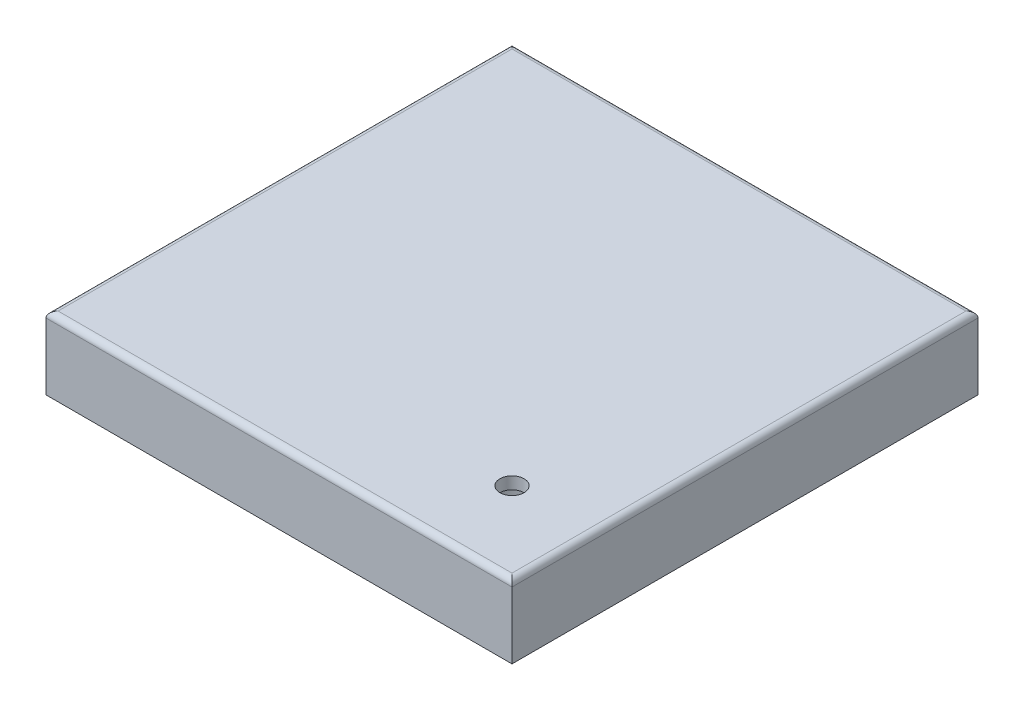
ISO-10303-21;
HEADER;
FILE_DESCRIPTION(('STEP AP214'),'2;1');
FILE_NAME('part.step','',(''),(''),'','','');
FILE_SCHEMA(('AUTOMOTIVE_DESIGN { 1 0 10303 214 1 1 1 1 }'));
ENDSEC;
DATA;
#1=APPLICATION_CONTEXT('core data for automotive mechanical design processes');
#2=APPLICATION_PROTOCOL_DEFINITION('international standard','automotive_design',2000,#1);
#3=PRODUCT_CONTEXT('',#1,'mechanical');
#4=PRODUCT('Part','Part','',(#3));
#5=PRODUCT_RELATED_PRODUCT_CATEGORY('part','',(#4));
#6=PRODUCT_DEFINITION_FORMATION('','',#4);
#7=PRODUCT_DEFINITION_CONTEXT('part definition',#1,'design');
#8=PRODUCT_DEFINITION('design','',#6,#7);
#9=PRODUCT_DEFINITION_SHAPE('','',#8);
#10=(LENGTH_UNIT() NAMED_UNIT(*) SI_UNIT(.MILLI.,.METRE.));
#11=(NAMED_UNIT(*) PLANE_ANGLE_UNIT() SI_UNIT($,.RADIAN.));
#12=(NAMED_UNIT(*) SI_UNIT($,.STERADIAN.) SOLID_ANGLE_UNIT());
#13=UNCERTAINTY_MEASURE_WITH_UNIT(LENGTH_MEASURE(1.E-05),#10,'distance_accuracy_value','');
#14=(GEOMETRIC_REPRESENTATION_CONTEXT(3) GLOBAL_UNCERTAINTY_ASSIGNED_CONTEXT((#13)) GLOBAL_UNIT_ASSIGNED_CONTEXT((#10,
#11,#12)) REPRESENTATION_CONTEXT('',''));
#15=CARTESIAN_POINT('',(0.,0.,0.));
#16=DIRECTION('',(0.,0.,1.));
#17=DIRECTION('',(1.,0.,0.));
#18=AXIS2_PLACEMENT_3D('',#15,#16,#17);
#19=CARTESIAN_POINT('',(23.9999999999999,-13.,-58.0543320314029));
#20=DIRECTION('',(0.,0.,1.));
#21=DIRECTION('',(1.,0.,0.));
#22=AXIS2_PLACEMENT_3D('',#19,#20,#21);
#23=PLANE('',#22);
#24=DIRECTION('',(0.,1.,0.));
#25=VECTOR('',#24,1.);
#26=CARTESIAN_POINT('',(23.9999999999999,-13.,-58.0543320314029));
#27=LINE('',#26,#25);
#28=CARTESIAN_POINT('',(23.9999999999999,-13.,-58.0543320314029));
#29=VERTEX_POINT('',#28);
#30=CARTESIAN_POINT('',(23.9999999999999,-10.,-58.0543320314029));
#31=VERTEX_POINT('',#30);
#32=EDGE_CURVE('E202',#29,#31,#27,.T.);
#33=ORIENTED_EDGE('',*,*,#32,.T.);
#34=DIRECTION('',(-1.,0.,0.));
#35=VECTOR('',#34,1.);
#36=CARTESIAN_POINT('',(-42.0000000000001,-10.,-58.0543320314029));
#37=LINE('',#36,#35);
#38=CARTESIAN_POINT('',(-17.0000000000001,-10.,-58.0543320314029));
#39=VERTEX_POINT('',#38);
#40=EDGE_CURVE('E78',#31,#39,#37,.T.);
#41=ORIENTED_EDGE('',*,*,#40,.T.);
#42=DIRECTION('',(0.,1.,0.));
#43=VECTOR('',#42,1.);
#44=CARTESIAN_POINT('',(-17.0000000000001,-13.,-58.0543320314029));
#45=LINE('',#44,#43);
#46=CARTESIAN_POINT('',(-17.0000000000001,-13.,-58.0543320314029));
#47=VERTEX_POINT('',#46);
#48=EDGE_CURVE('E167',#47,#39,#45,.T.);
#49=ORIENTED_EDGE('',*,*,#48,.F.);
#50=DIRECTION('',(1.,0.,0.));
#51=VECTOR('',#50,1.);
#52=CARTESIAN_POINT('',(23.9999999999999,-13.,-58.0543320314029));
#53=LINE('',#52,#51);
#54=EDGE_CURVE('E177',#47,#29,#53,.T.);
#55=ORIENTED_EDGE('',*,*,#54,.T.);
#56=EDGE_LOOP('',(#33,#41,#49,#55));
#57=FACE_BOUND('',#56,.T.);
#58=ADVANCED_FACE('F68',(#57),#23,.T.);
#59=CARTESIAN_POINT('',(0.,-13.,0.));
#60=DIRECTION('',(0.,-1.,0.));
#61=DIRECTION('',(0.,0.,-1.));
#62=AXIS2_PLACEMENT_3D('',#59,#60,#61);
#63=PLANE('',#62);
#64=DIRECTION('',(0.,0.,-1.));
#65=VECTOR('',#64,1.);
#66=CARTESIAN_POINT('',(-17.0000000000001,-13.,-53.5543320314029));
#67=LINE('',#66,#65);
#68=CARTESIAN_POINT('',(-17.0000000000001,-13.,-60.0543320314029));
#69=VERTEX_POINT('',#68);
#70=EDGE_CURVE('E163',#47,#69,#67,.T.);
#71=ORIENTED_EDGE('',*,*,#70,.T.);
#72=DIRECTION('',(1.,0.,0.));
#73=VECTOR('',#72,1.);
#74=CARTESIAN_POINT('',(25.9999999999999,-13.,-60.0543320314029));
#75=LINE('',#74,#73);
#76=CARTESIAN_POINT('',(25.9999999999999,-13.,-60.0543320314029));
#77=VERTEX_POINT('',#76);
#78=EDGE_CURVE('E210',#69,#77,#75,.T.);
#79=ORIENTED_EDGE('',*,*,#78,.T.);
#80=DIRECTION('',(0.,0.,1.));
#81=VECTOR('',#80,1.);
#82=CARTESIAN_POINT('',(25.9999999999999,-13.,-60.0543320314029));
#83=LINE('',#82,#81);
#84=CARTESIAN_POINT('',(25.9999999999999,-13.,9.94566796859713));
#85=VERTEX_POINT('',#84);
#86=EDGE_CURVE('E215',#77,#85,#83,.T.);
#87=ORIENTED_EDGE('',*,*,#86,.T.);
#88=DIRECTION('',(-1.,0.,0.));
#89=VECTOR('',#88,1.);
#90=CARTESIAN_POINT('',(25.9999999999999,-13.,9.94566796859713));
#91=LINE('',#90,#89);
#92=CARTESIAN_POINT('',(-44.0000000000001,-13.,9.94566796859712));
#93=VERTEX_POINT('',#92);
#94=EDGE_CURVE('E217',#85,#93,#91,.T.);
#95=ORIENTED_EDGE('',*,*,#94,.T.);
#96=DIRECTION('',(0.,0.,-1.));
#97=VECTOR('',#96,1.);
#98=CARTESIAN_POINT('',(-44.0000000000001,-13.,-60.0543320314029));
#99=LINE('',#98,#97);
#100=CARTESIAN_POINT('',(-44.0000000000001,-13.,-60.0543320314029));
#101=VERTEX_POINT('',#100);
#102=EDGE_CURVE('E207',#93,#101,#99,.T.);
#103=ORIENTED_EDGE('',*,*,#102,.T.);
#104=CARTESIAN_POINT('',(-32.0000000000001,-13.,-60.0543320314029));
#105=VERTEX_POINT('',#104);
#106=EDGE_CURVE('E212',#101,#105,#75,.T.);
#107=ORIENTED_EDGE('',*,*,#106,.T.);
#108=DIRECTION('',(0.,0.,-1.));
#109=VECTOR('',#108,1.);
#110=CARTESIAN_POINT('',(-32.0000000000001,-13.,-53.5543320314029));
#111=LINE('',#110,#109);
#112=CARTESIAN_POINT('',(-32.0000000000001,-13.,-58.0543320314029));
#113=VERTEX_POINT('',#112);
#114=EDGE_CURVE('E174',#113,#105,#111,.T.);
#115=ORIENTED_EDGE('',*,*,#114,.F.);
#116=CARTESIAN_POINT('',(-42.0000000000001,-13.,-58.0543320314029));
#117=VERTEX_POINT('',#116);
#118=EDGE_CURVE('E187',#117,#113,#53,.T.);
#119=ORIENTED_EDGE('',*,*,#118,.F.);
#120=DIRECTION('',(0.,0.,-1.));
#121=VECTOR('',#120,1.);
#122=CARTESIAN_POINT('',(-42.0000000000001,-13.,-58.0543320314029));
#123=LINE('',#122,#121);
#124=CARTESIAN_POINT('',(-42.0000000000001,-13.,7.94566796859712));
#125=VERTEX_POINT('',#124);
#126=EDGE_CURVE('E188',#125,#117,#123,.T.);
#127=ORIENTED_EDGE('',*,*,#126,.F.);
#128=DIRECTION('',(-1.,0.,0.));
#129=VECTOR('',#128,1.);
#130=CARTESIAN_POINT('',(23.9999999999999,-13.,7.94566796859712));
#131=LINE('',#130,#129);
#132=CARTESIAN_POINT('',(23.9999999999999,-13.,7.94566796859712));
#133=VERTEX_POINT('',#132);
#134=EDGE_CURVE('E195',#133,#125,#131,.T.);
#135=ORIENTED_EDGE('',*,*,#134,.F.);
#136=DIRECTION('',(0.,0.,1.));
#137=VECTOR('',#136,1.);
#138=CARTESIAN_POINT('',(23.9999999999999,-13.,-58.0543320314029));
#139=LINE('',#138,#137);
#140=EDGE_CURVE('E186',#29,#133,#139,.T.);
#141=ORIENTED_EDGE('',*,*,#140,.F.);
#142=ORIENTED_EDGE('',*,*,#54,.F.);
#143=EDGE_LOOP('',(#71,#79,#87,#95,#103,#107,#115,#119,#127,#135,#141,#142));
#144=FACE_BOUND('',#143,.T.);
#145=ADVANCED_FACE('F183',(#144),#63,.T.);
#146=CARTESIAN_POINT('',(-44.0000000000001,-13.,-60.0543320314029));
#147=DIRECTION('',(1.,0.,0.));
#148=DIRECTION('',(0.,0.,-1.));
#149=AXIS2_PLACEMENT_3D('',#146,#147,#148);
#150=PLANE('',#149);
#151=DIRECTION('',(0.,0.,-1.));
#152=VECTOR('',#151,1.);
#153=CARTESIAN_POINT('',(-44.0000000000001,-8.,-60.0543320314029));
#154=LINE('',#153,#152);
#155=CARTESIAN_POINT('',(-44.0000000000001,-8.,9.94566796859712));
#156=VERTEX_POINT('',#155);
#157=CARTESIAN_POINT('',(-44.0000000000001,-8.,-60.0543320314029));
#158=VERTEX_POINT('',#157);
#159=EDGE_CURVE('E206',#156,#158,#154,.T.);
#160=ORIENTED_EDGE('',*,*,#159,.T.);
#161=DIRECTION('',(0.,1.,0.));
#162=VECTOR('',#161,1.);
#163=CARTESIAN_POINT('',(-44.0000000000001,-13.,-60.0543320314029));
#164=LINE('',#163,#162);
#165=EDGE_CURVE('E236',#101,#158,#164,.T.);
#166=ORIENTED_EDGE('',*,*,#165,.F.);
#167=ORIENTED_EDGE('',*,*,#102,.F.);
#168=DIRECTION('',(0.,1.,0.));
#169=VECTOR('',#168,1.);
#170=CARTESIAN_POINT('',(-44.0000000000001,-13.,9.94566796859712));
#171=LINE('',#170,#169);
#172=EDGE_CURVE('E219',#93,#156,#171,.T.);
#173=ORIENTED_EDGE('',*,*,#172,.T.);
#174=EDGE_LOOP('',(#160,#166,#167,#173));
#175=FACE_BOUND('',#174,.T.);
#176=ADVANCED_FACE('F300',(#175),#150,.F.);
#177=CARTESIAN_POINT('',(25.9999999999999,-13.,-60.0543320314029));
#178=DIRECTION('',(0.,0.,1.));
#179=DIRECTION('',(1.,0.,0.));
#180=AXIS2_PLACEMENT_3D('',#177,#178,#179);
#181=PLANE('',#180);
#182=ORIENTED_EDGE('',*,*,#78,.F.);
#183=DIRECTION('',(0.,1.,0.));
#184=VECTOR('',#183,1.);
#185=CARTESIAN_POINT('',(-17.0000000000001,-13.,-60.0543320314029));
#186=LINE('',#185,#184);
#187=CARTESIAN_POINT('',(-17.0000000000001,-10.,-60.0543320314029));
#188=VERTEX_POINT('',#187);
#189=EDGE_CURVE('E170',#69,#188,#186,.T.);
#190=ORIENTED_EDGE('',*,*,#189,.T.);
#191=DIRECTION('',(-1.,0.,0.));
#192=VECTOR('',#191,1.);
#193=CARTESIAN_POINT('',(25.9999999999999,-10.,-60.0543320314029));
#194=LINE('',#193,#192);
#195=CARTESIAN_POINT('',(-32.0000000000001,-10.,-60.0543320314029));
#196=VERTEX_POINT('',#195);
#197=EDGE_CURVE('E284',#188,#196,#194,.T.);
#198=ORIENTED_EDGE('',*,*,#197,.T.);
#199=DIRECTION('',(0.,-1.,0.));
#200=VECTOR('',#199,1.);
#201=CARTESIAN_POINT('',(-32.0000000000001,-13.,-60.0543320314029));
#202=LINE('',#201,#200);
#203=EDGE_CURVE('E282',#196,#105,#202,.T.);
#204=ORIENTED_EDGE('',*,*,#203,.T.);
#205=ORIENTED_EDGE('',*,*,#106,.F.);
#206=ORIENTED_EDGE('',*,*,#165,.T.);
#207=DIRECTION('',(1.,0.,0.));
#208=VECTOR('',#207,1.);
#209=CARTESIAN_POINT('',(25.9999999999999,-8.,-60.0543320314029));
#210=LINE('',#209,#208);
#211=CARTESIAN_POINT('',(25.9999999999999,-8.,-60.0543320314029));
#212=VERTEX_POINT('',#211);
#213=EDGE_CURVE('E222',#158,#212,#210,.T.);
#214=ORIENTED_EDGE('',*,*,#213,.T.);
#215=DIRECTION('',(0.,1.,0.));
#216=VECTOR('',#215,1.);
#217=CARTESIAN_POINT('',(25.9999999999999,-13.,-60.0543320314029));
#218=LINE('',#217,#216);
#219=EDGE_CURVE('E233',#77,#212,#218,.T.);
#220=ORIENTED_EDGE('',*,*,#219,.F.);
#221=EDGE_LOOP('',(#182,#190,#198,#204,#205,#206,#214,#220));
#222=FACE_BOUND('',#221,.T.);
#223=ADVANCED_FACE('F286',(#222),#181,.F.);
#224=CARTESIAN_POINT('',(25.9999999999999,-13.,-60.0543320314029));
#225=DIRECTION('',(-1.,0.,0.));
#226=DIRECTION('',(0.,0.,1.));
#227=AXIS2_PLACEMENT_3D('',#224,#225,#226);
#228=PLANE('',#227);
#229=DIRECTION('',(0.,0.,1.));
#230=VECTOR('',#229,1.);
#231=CARTESIAN_POINT('',(25.9999999999999,-8.,-60.0543320314029));
#232=LINE('',#231,#230);
#233=CARTESIAN_POINT('',(25.9999999999999,-8.,9.94566796859713));
#234=VERTEX_POINT('',#233);
#235=EDGE_CURVE('E224',#212,#234,#232,.T.);
#236=ORIENTED_EDGE('',*,*,#235,.T.);
#237=DIRECTION('',(0.,1.,0.));
#238=VECTOR('',#237,1.);
#239=CARTESIAN_POINT('',(25.9999999999999,-13.,9.94566796859713));
#240=LINE('',#239,#238);
#241=EDGE_CURVE('E230',#85,#234,#240,.T.);
#242=ORIENTED_EDGE('',*,*,#241,.F.);
#243=ORIENTED_EDGE('',*,*,#86,.F.);
#244=ORIENTED_EDGE('',*,*,#219,.T.);
#245=EDGE_LOOP('',(#236,#242,#243,#244));
#246=FACE_BOUND('',#245,.T.);
#247=ADVANCED_FACE('F293',(#246),#228,.F.);
#248=CARTESIAN_POINT('',(25.9999999999999,-13.,9.94566796859713));
#249=DIRECTION('',(0.,0.,-1.));
#250=DIRECTION('',(-1.,0.,0.));
#251=AXIS2_PLACEMENT_3D('',#248,#249,#250);
#252=PLANE('',#251);
#253=DIRECTION('',(-1.,0.,0.));
#254=VECTOR('',#253,1.);
#255=CARTESIAN_POINT('',(25.9999999999999,-8.,9.94566796859713));
#256=LINE('',#255,#254);
#257=EDGE_CURVE('E211',#234,#156,#256,.T.);
#258=ORIENTED_EDGE('',*,*,#257,.T.);
#259=ORIENTED_EDGE('',*,*,#172,.F.);
#260=ORIENTED_EDGE('',*,*,#94,.F.);
#261=ORIENTED_EDGE('',*,*,#241,.T.);
#262=EDGE_LOOP('',(#258,#259,#260,#261));
#263=FACE_BOUND('',#262,.T.);
#264=ADVANCED_FACE('F295',(#263),#252,.F.);
#265=CARTESIAN_POINT('',(-42.0000000000001,-13.,-58.0543320314029));
#266=DIRECTION('',(1.,0.,0.));
#267=DIRECTION('',(0.,0.,-1.));
#268=AXIS2_PLACEMENT_3D('',#265,#266,#267);
#269=PLANE('',#268);
#270=DIRECTION('',(0.,1.,0.));
#271=VECTOR('',#270,1.);
#272=CARTESIAN_POINT('',(-42.0000000000001,-13.,-58.0543320314029));
#273=LINE('',#272,#271);
#274=CARTESIAN_POINT('',(-42.0000000000001,-10.,-58.0543320314029));
#275=VERTEX_POINT('',#274);
#276=EDGE_CURVE('E204',#117,#275,#273,.T.);
#277=ORIENTED_EDGE('',*,*,#276,.T.);
#278=DIRECTION('',(0.,0.,1.));
#279=VECTOR('',#278,1.);
#280=CARTESIAN_POINT('',(-42.0000000000001,-10.,7.94566796859712));
#281=LINE('',#280,#279);
#282=CARTESIAN_POINT('',(-42.0000000000001,-10.,7.94566796859712));
#283=VERTEX_POINT('',#282);
#284=EDGE_CURVE('E13',#275,#283,#281,.T.);
#285=ORIENTED_EDGE('',*,*,#284,.T.);
#286=DIRECTION('',(0.,1.,0.));
#287=VECTOR('',#286,1.);
#288=CARTESIAN_POINT('',(-42.0000000000001,-13.,7.94566796859712));
#289=LINE('',#288,#287);
#290=EDGE_CURVE('E197',#125,#283,#289,.T.);
#291=ORIENTED_EDGE('',*,*,#290,.F.);
#292=ORIENTED_EDGE('',*,*,#126,.T.);
#293=EDGE_LOOP('',(#277,#285,#291,#292));
#294=FACE_BOUND('',#293,.T.);
#295=ADVANCED_FACE('F311',(#294),#269,.T.);
#296=DIRECTION('',(0.,-1.,0.));
#297=VECTOR('',#296,1.);
#298=CARTESIAN_POINT('',(-32.0000000000001,-13.,-58.0543320314029));
#299=LINE('',#298,#297);
#300=CARTESIAN_POINT('',(-32.0000000000001,-10.,-58.0543320314029));
#301=VERTEX_POINT('',#300);
#302=EDGE_CURVE('E238',#301,#113,#299,.T.);
#303=ORIENTED_EDGE('',*,*,#302,.F.);
#304=DIRECTION('',(-1.,0.,0.));
#305=VECTOR('',#304,1.);
#306=CARTESIAN_POINT('',(-42.0000000000001,-10.,-58.0543320314029));
#307=LINE('',#306,#305);
#308=EDGE_CURVE('E86',#301,#275,#307,.T.);
#309=ORIENTED_EDGE('',*,*,#308,.T.);
#310=ORIENTED_EDGE('',*,*,#276,.F.);
#311=ORIENTED_EDGE('',*,*,#118,.T.);
#312=EDGE_LOOP('',(#303,#309,#310,#311));
#313=FACE_BOUND('',#312,.T.);
#314=ADVANCED_FACE('F271',(#313),#23,.T.);
#315=CARTESIAN_POINT('',(23.9999999999999,-13.,-58.0543320314029));
#316=DIRECTION('',(-1.,0.,0.));
#317=DIRECTION('',(0.,0.,1.));
#318=AXIS2_PLACEMENT_3D('',#315,#316,#317);
#319=PLANE('',#318);
#320=DIRECTION('',(0.,1.,0.));
#321=VECTOR('',#320,1.);
#322=CARTESIAN_POINT('',(23.9999999999999,-13.,7.94566796859712));
#323=LINE('',#322,#321);
#324=CARTESIAN_POINT('',(23.9999999999999,-10.,7.94566796859712));
#325=VERTEX_POINT('',#324);
#326=EDGE_CURVE('E200',#133,#325,#323,.T.);
#327=ORIENTED_EDGE('',*,*,#326,.T.);
#328=DIRECTION('',(0.,0.,-1.));
#329=VECTOR('',#328,1.);
#330=CARTESIAN_POINT('',(23.9999999999999,-10.,-58.0543320314029));
#331=LINE('',#330,#329);
#332=EDGE_CURVE('E94',#325,#31,#331,.T.);
#333=ORIENTED_EDGE('',*,*,#332,.T.);
#334=ORIENTED_EDGE('',*,*,#32,.F.);
#335=ORIENTED_EDGE('',*,*,#140,.T.);
#336=EDGE_LOOP('',(#327,#333,#334,#335));
#337=FACE_BOUND('',#336,.T.);
#338=ADVANCED_FACE('F309',(#337),#319,.T.);
#339=CARTESIAN_POINT('',(23.9999999999999,-13.,7.94566796859712));
#340=DIRECTION('',(0.,0.,-1.));
#341=DIRECTION('',(-1.,0.,0.));
#342=AXIS2_PLACEMENT_3D('',#339,#340,#341);
#343=PLANE('',#342);
#344=ORIENTED_EDGE('',*,*,#290,.T.);
#345=DIRECTION('',(1.,0.,0.));
#346=VECTOR('',#345,1.);
#347=CARTESIAN_POINT('',(23.9999999999999,-10.,7.94566796859712));
#348=LINE('',#347,#346);
#349=EDGE_CURVE('E179',#283,#325,#348,.T.);
#350=ORIENTED_EDGE('',*,*,#349,.T.);
#351=ORIENTED_EDGE('',*,*,#326,.F.);
#352=ORIENTED_EDGE('',*,*,#134,.T.);
#353=EDGE_LOOP('',(#344,#350,#351,#352));
#354=FACE_BOUND('',#353,.T.);
#355=ADVANCED_FACE('F307',(#354),#343,.T.);
#356=CARTESIAN_POINT('',(-17.0000000000001,-13.,-53.5543320314029));
#357=DIRECTION('',(1.,0.,0.));
#358=DIRECTION('',(0.,0.,-1.));
#359=AXIS2_PLACEMENT_3D('',#356,#357,#358);
#360=PLANE('',#359);
#361=ORIENTED_EDGE('',*,*,#70,.F.);
#362=ORIENTED_EDGE('',*,*,#48,.T.);
#363=DIRECTION('',(0.,0.,-1.));
#364=VECTOR('',#363,1.);
#365=CARTESIAN_POINT('',(-17.0000000000001,-10.,-53.5543320314029));
#366=LINE('',#365,#364);
#367=EDGE_CURVE('E270',#39,#188,#366,.T.);
#368=ORIENTED_EDGE('',*,*,#367,.T.);
#369=ORIENTED_EDGE('',*,*,#189,.F.);
#370=EDGE_LOOP('',(#361,#362,#368,#369));
#371=FACE_BOUND('',#370,.T.);
#372=ADVANCED_FACE('F165',(#371),#360,.F.);
#373=CARTESIAN_POINT('',(-17.0000000000001,-10.,-53.5543320314029));
#374=DIRECTION('',(0.,1.,0.));
#375=DIRECTION('',(0.,0.,1.));
#376=AXIS2_PLACEMENT_3D('',#373,#374,#375);
#377=PLANE('',#376);
#378=ORIENTED_EDGE('',*,*,#367,.F.);
#379=DIRECTION('',(-1.,0.,0.));
#380=VECTOR('',#379,1.);
#381=CARTESIAN_POINT('',(23.9999999999999,-10.,-58.0543320314029));
#382=LINE('',#381,#380);
#383=EDGE_CURVE('E180',#39,#301,#382,.T.);
#384=ORIENTED_EDGE('',*,*,#383,.T.);
#385=DIRECTION('',(0.,0.,-1.));
#386=VECTOR('',#385,1.);
#387=CARTESIAN_POINT('',(-32.0000000000001,-10.,-53.5543320314029));
#388=LINE('',#387,#386);
#389=EDGE_CURVE('E268',#301,#196,#388,.T.);
#390=ORIENTED_EDGE('',*,*,#389,.T.);
#391=ORIENTED_EDGE('',*,*,#197,.F.);
#392=EDGE_LOOP('',(#378,#384,#390,#391));
#393=FACE_BOUND('',#392,.T.);
#394=ADVANCED_FACE('F267',(#393),#377,.F.);
#395=CARTESIAN_POINT('',(-32.0000000000001,-13.,-53.5543320314029));
#396=DIRECTION('',(-1.,0.,0.));
#397=DIRECTION('',(0.,0.,1.));
#398=AXIS2_PLACEMENT_3D('',#395,#396,#397);
#399=PLANE('',#398);
#400=ORIENTED_EDGE('',*,*,#389,.F.);
#401=ORIENTED_EDGE('',*,*,#302,.T.);
#402=ORIENTED_EDGE('',*,*,#114,.T.);
#403=ORIENTED_EDGE('',*,*,#203,.F.);
#404=EDGE_LOOP('',(#400,#401,#402,#403));
#405=FACE_BOUND('',#404,.T.);
#406=ADVANCED_FACE('F275',(#405),#399,.F.);
#407=CARTESIAN_POINT('',(0.,-8.,-60.0543320314029));
#408=DIRECTION('',(0.,0.707106781186545,0.70710678118655));
#409=DIRECTION('',(-1.,0.,0.));
#410=AXIS2_PLACEMENT_3D('',#407,#408,#409);
#411=PLANE('',#410);
#412=ORIENTED_EDGE('',*,*,#383,.F.);
#413=ORIENTED_EDGE('',*,*,#40,.F.);
#414=DIRECTION('',(0.577350269189624,0.577350269189628,-0.577350269189624));
#415=VECTOR('',#414,1.);
#416=CARTESIAN_POINT('',(5.98188932286574,-28.0181106771343,-40.0362213542687));
#417=LINE('',#416,#415);
#418=EDGE_CURVE('E73',#212,#31,#417,.F.);
#419=ORIENTED_EDGE('',*,*,#418,.F.);
#420=ORIENTED_EDGE('',*,*,#213,.F.);
#421=DIRECTION('',(-0.577350269189624,0.577350269189628,-0.577350269189624));
#422=VECTOR('',#421,1.);
#423=CARTESIAN_POINT('',(-29.3333333333334,-22.6666666666667,-45.3876653647363));
#424=LINE('',#423,#422);
#425=EDGE_CURVE('E250',#275,#158,#424,.T.);
#426=ORIENTED_EDGE('',*,*,#425,.F.);
#427=ORIENTED_EDGE('',*,*,#308,.F.);
#428=EDGE_LOOP('',(#412,#413,#419,#420,#426,#427));
#429=FACE_BOUND('',#428,.T.);
#430=ADVANCED_FACE('F71',(#429),#411,.T.);
#431=CARTESIAN_POINT('',(26.,-8.,0.));
#432=DIRECTION('',(-0.70710678118655,0.707106781186545,0.));
#433=DIRECTION('',(0.,0.,-1.));
#434=AXIS2_PLACEMENT_3D('',#431,#432,#433);
#435=PLANE('',#434);
#436=ORIENTED_EDGE('',*,*,#418,.T.);
#437=ORIENTED_EDGE('',*,*,#332,.F.);
#438=DIRECTION('',(0.577350269189624,0.577350269189628,0.577350269189624));
#439=VECTOR('',#438,1.);
#440=CARTESIAN_POINT('',(17.3333333333333,-16.6666666666667,1.27900130193051));
#441=LINE('',#440,#439);
#442=EDGE_CURVE('E249',#234,#325,#441,.F.);
#443=ORIENTED_EDGE('',*,*,#442,.F.);
#444=ORIENTED_EDGE('',*,*,#235,.F.);
#445=EDGE_LOOP('',(#436,#437,#443,#444));
#446=FACE_BOUND('',#445,.T.);
#447=ADVANCED_FACE('F260',(#446),#435,.T.);
#448=CARTESIAN_POINT('',(-44.0000000000001,-8.,0.));
#449=DIRECTION('',(0.70710678118655,0.707106781186545,0.));
#450=DIRECTION('',(0.,0.,1.));
#451=AXIS2_PLACEMENT_3D('',#448,#449,#450);
#452=PLANE('',#451);
#453=ORIENTED_EDGE('',*,*,#425,.T.);
#454=ORIENTED_EDGE('',*,*,#159,.F.);
#455=DIRECTION('',(0.577350269189624,-0.577350269189628,-0.577350269189624));
#456=VECTOR('',#455,1.);
#457=CARTESIAN_POINT('',(-29.3333333333334,-22.6666666666667,-4.7209986980695));
#458=LINE('',#457,#456);
#459=EDGE_CURVE('E247',#283,#156,#458,.F.);
#460=ORIENTED_EDGE('',*,*,#459,.F.);
#461=ORIENTED_EDGE('',*,*,#284,.F.);
#462=EDGE_LOOP('',(#453,#454,#460,#461));
#463=FACE_BOUND('',#462,.T.);
#464=ADVANCED_FACE('F302',(#463),#452,.T.);
#465=CARTESIAN_POINT('',(0.,-8.,9.94566796859712));
#466=DIRECTION('',(0.,0.707106781186545,-0.70710678118655));
#467=DIRECTION('',(1.,0.,0.));
#468=AXIS2_PLACEMENT_3D('',#465,#466,#467);
#469=PLANE('',#468);
#470=ORIENTED_EDGE('',*,*,#442,.T.);
#471=ORIENTED_EDGE('',*,*,#349,.F.);
#472=ORIENTED_EDGE('',*,*,#459,.T.);
#473=ORIENTED_EDGE('',*,*,#257,.F.);
#474=EDGE_LOOP('',(#470,#471,#472,#473));
#475=FACE_BOUND('',#474,.T.);
#476=ADVANCED_FACE('F305',(#475),#469,.T.);
#477=CLOSED_SHELL('',(#58,#145,#176,#223,#247,#264,#295,#314,#338,#355,#372,#394,#406,#430,#447,
#464,#476));
#478=MANIFOLD_SOLID_BREP('B2',#477);
#479=CARTESIAN_POINT('',(29.4999999999999,2.,-63.5543320314029));
#480=DIRECTION('',(-1.,0.,0.));
#481=DIRECTION('',(0.,0.,1.));
#482=AXIS2_PLACEMENT_3D('',#479,#480,#481);
#483=PLANE('',#482);
#484=DIRECTION('',(0.,-1.,0.));
#485=VECTOR('',#484,1.);
#486=CARTESIAN_POINT('',(29.4999999999999,2.,-63.5543320314029));
#487=LINE('',#486,#485);
#488=CARTESIAN_POINT('',(29.4999999999999,1.,-63.5543320314029));
#489=VERTEX_POINT('',#488);
#490=CARTESIAN_POINT('',(29.4999999999999,-10.,-63.5543320314029));
#491=VERTEX_POINT('',#490);
#492=EDGE_CURVE('E617',#489,#491,#487,.T.);
#493=ORIENTED_EDGE('',*,*,#492,.F.);
#494=DIRECTION('',(0.,0.,-1.));
#495=VECTOR('',#494,1.);
#496=CARTESIAN_POINT('',(29.4999999999999,1.,13.4456679685971));
#497=LINE('',#496,#495);
#498=CARTESIAN_POINT('',(29.4999999999999,1.,13.4456679685971));
#499=VERTEX_POINT('',#498);
#500=EDGE_CURVE('E66',#489,#499,#497,.F.);
#501=ORIENTED_EDGE('',*,*,#500,.T.);
#502=DIRECTION('',(0.,-1.,0.));
#503=VECTOR('',#502,1.);
#504=CARTESIAN_POINT('',(29.4999999999999,2.,13.4456679685971));
#505=LINE('',#504,#503);
#506=CARTESIAN_POINT('',(29.4999999999999,-10.,13.4456679685971));
#507=VERTEX_POINT('',#506);
#508=EDGE_CURVE('E608',#499,#507,#505,.T.);
#509=ORIENTED_EDGE('',*,*,#508,.T.);
#510=DIRECTION('',(0.,0.,1.));
#511=VECTOR('',#510,1.);
#512=CARTESIAN_POINT('',(29.4999999999999,-10.,13.4456679685971));
#513=LINE('',#512,#511);
#514=EDGE_CURVE('E600',#491,#507,#513,.T.);
#515=ORIENTED_EDGE('',*,*,#514,.F.);
#516=EDGE_LOOP('',(#493,#501,#509,#515));
#517=FACE_BOUND('',#516,.T.);
#518=ADVANCED_FACE('F458',(#517),#483,.F.);
#519=CARTESIAN_POINT('',(-47.5000000000001,2.,-63.5543320314029));
#520=DIRECTION('',(0.,0.,1.));
#521=DIRECTION('',(1.,0.,0.));
#522=AXIS2_PLACEMENT_3D('',#519,#520,#521);
#523=PLANE('',#522);
#524=DIRECTION('',(0.,-1.,0.));
#525=VECTOR('',#524,1.);
#526=CARTESIAN_POINT('',(-47.5000000000001,2.,-63.5543320314029));
#527=LINE('',#526,#525);
#528=CARTESIAN_POINT('',(-47.5000000000001,1.,-63.5543320314029));
#529=VERTEX_POINT('',#528);
#530=CARTESIAN_POINT('',(-47.5000000000001,-10.,-63.5543320314029));
#531=VERTEX_POINT('',#530);
#532=EDGE_CURVE('E614',#529,#531,#527,.T.);
#533=ORIENTED_EDGE('',*,*,#532,.F.);
#534=DIRECTION('',(-1.,0.,0.));
#535=VECTOR('',#534,1.);
#536=CARTESIAN_POINT('',(29.4999999999999,1.,-63.5543320314029));
#537=LINE('',#536,#535);
#538=EDGE_CURVE('E643',#529,#489,#537,.F.);
#539=ORIENTED_EDGE('',*,*,#538,.T.);
#540=ORIENTED_EDGE('',*,*,#492,.T.);
#541=DIRECTION('',(1.,0.,0.));
#542=VECTOR('',#541,1.);
#543=CARTESIAN_POINT('',(-47.5000000000001,-10.,-63.5543320314029));
#544=LINE('',#543,#542);
#545=EDGE_CURVE('E596',#531,#491,#544,.T.);
#546=ORIENTED_EDGE('',*,*,#545,.F.);
#547=EDGE_LOOP('',(#533,#539,#540,#546));
#548=FACE_BOUND('',#547,.T.);
#549=ADVANCED_FACE('F715',(#548),#523,.F.);
#550=CARTESIAN_POINT('',(-47.5000000000001,2.,-63.5543320314029));
#551=DIRECTION('',(1.,0.,0.));
#552=DIRECTION('',(0.,0.,-1.));
#553=AXIS2_PLACEMENT_3D('',#550,#551,#552);
#554=PLANE('',#553);
#555=DIRECTION('',(0.,-1.,0.));
#556=VECTOR('',#555,1.);
#557=CARTESIAN_POINT('',(-47.5000000000001,2.,13.4456679685971));
#558=LINE('',#557,#556);
#559=CARTESIAN_POINT('',(-47.5000000000001,1.,13.4456679685971));
#560=VERTEX_POINT('',#559);
#561=CARTESIAN_POINT('',(-47.5000000000001,-10.,13.4456679685971));
#562=VERTEX_POINT('',#561);
#563=EDGE_CURVE('E611',#560,#562,#558,.T.);
#564=ORIENTED_EDGE('',*,*,#563,.F.);
#565=DIRECTION('',(0.,0.,1.));
#566=VECTOR('',#565,1.);
#567=CARTESIAN_POINT('',(-47.5000000000001,1.,-63.5543320314029));
#568=LINE('',#567,#566);
#569=EDGE_CURVE('E647',#560,#529,#568,.F.);
#570=ORIENTED_EDGE('',*,*,#569,.T.);
#571=ORIENTED_EDGE('',*,*,#532,.T.);
#572=DIRECTION('',(0.,0.,-1.));
#573=VECTOR('',#572,1.);
#574=CARTESIAN_POINT('',(-47.5000000000001,-10.,13.4456679685971));
#575=LINE('',#574,#573);
#576=EDGE_CURVE('E557',#562,#531,#575,.T.);
#577=ORIENTED_EDGE('',*,*,#576,.F.);
#578=EDGE_LOOP('',(#564,#570,#571,#577));
#579=FACE_BOUND('',#578,.T.);
#580=ADVANCED_FACE('F721',(#579),#554,.F.);
#581=CARTESIAN_POINT('',(-47.5000000000001,2.,13.4456679685971));
#582=DIRECTION('',(0.,0.,-1.));
#583=DIRECTION('',(-1.,0.,0.));
#584=AXIS2_PLACEMENT_3D('',#581,#582,#583);
#585=PLANE('',#584);
#586=ORIENTED_EDGE('',*,*,#508,.F.);
#587=DIRECTION('',(1.,0.,0.));
#588=VECTOR('',#587,1.);
#589=CARTESIAN_POINT('',(-47.5000000000001,1.,13.4456679685971));
#590=LINE('',#589,#588);
#591=EDGE_CURVE('E468',#499,#560,#590,.F.);
#592=ORIENTED_EDGE('',*,*,#591,.T.);
#593=ORIENTED_EDGE('',*,*,#563,.T.);
#594=DIRECTION('',(-1.,0.,0.));
#595=VECTOR('',#594,1.);
#596=CARTESIAN_POINT('',(-47.5000000000001,-10.,13.4456679685971));
#597=LINE('',#596,#595);
#598=EDGE_CURVE('E604',#507,#562,#597,.T.);
#599=ORIENTED_EDGE('',*,*,#598,.F.);
#600=EDGE_LOOP('',(#586,#592,#593,#599));
#601=FACE_BOUND('',#600,.T.);
#602=ADVANCED_FACE('F756',(#601),#585,.F.);
#603=CARTESIAN_POINT('',(0.,2.,0.));
#604=DIRECTION('',(0.,1.,0.));
#605=DIRECTION('',(0.,0.,1.));
#606=AXIS2_PLACEMENT_3D('',#603,#604,#605);
#607=PLANE('',#606);
#608=DIRECTION('',(0.,0.,-1.));
#609=VECTOR('',#608,1.);
#610=CARTESIAN_POINT('',(28.4999999999999,2.,-63.5543320314029));
#611=LINE('',#610,#609);
#612=CARTESIAN_POINT('',(28.4999999999999,2.,12.4456679685971));
#613=VERTEX_POINT('',#612);
#614=CARTESIAN_POINT('',(28.4999999999999,2.,-62.5543320314029));
#615=VERTEX_POINT('',#614);
#616=EDGE_CURVE('E624',#613,#615,#611,.T.);
#617=ORIENTED_EDGE('',*,*,#616,.T.);
#618=DIRECTION('',(-1.,0.,0.));
#619=VECTOR('',#618,1.);
#620=CARTESIAN_POINT('',(-47.5000000000001,2.,-62.5543320314029));
#621=LINE('',#620,#619);
#622=CARTESIAN_POINT('',(-46.5000000000001,2.,-62.5543320314029));
#623=VERTEX_POINT('',#622);
#624=EDGE_CURVE('E639',#615,#623,#621,.T.);
#625=ORIENTED_EDGE('',*,*,#624,.T.);
#626=DIRECTION('',(0.,0.,1.));
#627=VECTOR('',#626,1.);
#628=CARTESIAN_POINT('',(-46.5000000000001,2.,13.4456679685971));
#629=LINE('',#628,#627);
#630=CARTESIAN_POINT('',(-46.5000000000001,2.,12.4456679685971));
#631=VERTEX_POINT('',#630);
#632=EDGE_CURVE('E636',#623,#631,#629,.T.);
#633=ORIENTED_EDGE('',*,*,#632,.T.);
#634=DIRECTION('',(1.,0.,0.));
#635=VECTOR('',#634,1.);
#636=CARTESIAN_POINT('',(29.4999999999999,2.,12.4456679685971));
#637=LINE('',#636,#635);
#638=EDGE_CURVE('E633',#631,#613,#637,.T.);
#639=ORIENTED_EDGE('',*,*,#638,.T.);
#640=EDGE_LOOP('',(#617,#625,#633,#639));
#641=FACE_BOUND('',#640,.T.);
#642=CARTESIAN_POINT('',(15.9999999999999,2.,-0.0543320314028775));
#643=DIRECTION('',(0.,1.,0.));
#644=DIRECTION('',(0.,0.,1.));
#645=AXIS2_PLACEMENT_3D('',#642,#643,#644);
#646=CIRCLE('',#645,2.);
#647=CARTESIAN_POINT('',(15.9999999999999,2.,1.94566796859712));
#648=VERTEX_POINT('',#647);
#649=EDGE_CURVE('E625',#648,#648,#646,.T.);
#650=ORIENTED_EDGE('',*,*,#649,.F.);
#651=EDGE_LOOP('',(#650));
#652=FACE_BOUND('',#651,.T.);
#653=ADVANCED_FACE('F754',(#641,#652),#607,.T.);
#654=CARTESIAN_POINT('',(0.,-10.,0.));
#655=DIRECTION('',(0.,-1.,0.));
#656=DIRECTION('',(0.,0.,-1.));
#657=AXIS2_PLACEMENT_3D('',#654,#655,#656);
#658=PLANE('',#657);
#659=ORIENTED_EDGE('',*,*,#576,.T.);
#660=ORIENTED_EDGE('',*,*,#545,.T.);
#661=ORIENTED_EDGE('',*,*,#514,.T.);
#662=ORIENTED_EDGE('',*,*,#598,.T.);
#663=EDGE_LOOP('',(#659,#660,#661,#662));
#664=FACE_BOUND('',#663,.T.);
#665=DIRECTION('',(-1.,0.,0.));
#666=VECTOR('',#665,1.);
#667=CARTESIAN_POINT('',(25.9999999999999,-10.,9.94566796859712));
#668=LINE('',#667,#666);
#669=CARTESIAN_POINT('',(25.9999999999999,-10.,9.94566796859712));
#670=VERTEX_POINT('',#669);
#671=CARTESIAN_POINT('',(-44.0000000000001,-10.,9.94566796859712));
#672=VERTEX_POINT('',#671);
#673=EDGE_CURVE('E548',#670,#672,#668,.T.);
#674=ORIENTED_EDGE('',*,*,#673,.F.);
#675=DIRECTION('',(0.,0.,1.));
#676=VECTOR('',#675,1.);
#677=CARTESIAN_POINT('',(25.9999999999999,-10.,-60.0543320314029));
#678=LINE('',#677,#676);
#679=CARTESIAN_POINT('',(25.9999999999999,-10.,-60.0543320314029));
#680=VERTEX_POINT('',#679);
#681=EDGE_CURVE('E537',#680,#670,#678,.T.);
#682=ORIENTED_EDGE('',*,*,#681,.F.);
#683=DIRECTION('',(1.,0.,0.));
#684=VECTOR('',#683,1.);
#685=CARTESIAN_POINT('',(25.9999999999999,-10.,-60.0543320314029));
#686=LINE('',#685,#684);
#687=CARTESIAN_POINT('',(-44.0000000000001,-10.,-60.0543320314029));
#688=VERTEX_POINT('',#687);
#689=EDGE_CURVE('E567',#688,#680,#686,.T.);
#690=ORIENTED_EDGE('',*,*,#689,.F.);
#691=DIRECTION('',(0.,0.,-1.));
#692=VECTOR('',#691,1.);
#693=CARTESIAN_POINT('',(-44.0000000000001,-10.,-60.0543320314029));
#694=LINE('',#693,#692);
#695=EDGE_CURVE('E563',#672,#688,#694,.T.);
#696=ORIENTED_EDGE('',*,*,#695,.F.);
#697=EDGE_LOOP('',(#674,#682,#690,#696));
#698=FACE_BOUND('',#697,.T.);
#699=ADVANCED_FACE('F561',(#664,#698),#658,.T.);
#700=CARTESIAN_POINT('',(25.9999999999999,-10.,-60.0543320314029));
#701=DIRECTION('',(-1.,0.,0.));
#702=DIRECTION('',(0.,0.,1.));
#703=AXIS2_PLACEMENT_3D('',#700,#701,#702);
#704=PLANE('',#703);
#705=DIRECTION('',(0.,0.,1.));
#706=VECTOR('',#705,1.);
#707=CARTESIAN_POINT('',(25.9999999999999,0.,-60.0543320314029));
#708=LINE('',#707,#706);
#709=CARTESIAN_POINT('',(25.9999999999999,0.,-60.0543320314029));
#710=VERTEX_POINT('',#709);
#711=CARTESIAN_POINT('',(25.9999999999999,0.,9.94566796859712));
#712=VERTEX_POINT('',#711);
#713=EDGE_CURVE('E573',#710,#712,#708,.T.);
#714=ORIENTED_EDGE('',*,*,#713,.F.);
#715=DIRECTION('',(0.,1.,0.));
#716=VECTOR('',#715,1.);
#717=CARTESIAN_POINT('',(25.9999999999999,-10.,-60.0543320314029));
#718=LINE('',#717,#716);
#719=EDGE_CURVE('E543',#680,#710,#718,.T.);
#720=ORIENTED_EDGE('',*,*,#719,.F.);
#721=ORIENTED_EDGE('',*,*,#681,.T.);
#722=DIRECTION('',(0.,1.,0.));
#723=VECTOR('',#722,1.);
#724=CARTESIAN_POINT('',(25.9999999999999,-10.,9.94566796859712));
#725=LINE('',#724,#723);
#726=EDGE_CURVE('E541',#670,#712,#725,.T.);
#727=ORIENTED_EDGE('',*,*,#726,.T.);
#728=EDGE_LOOP('',(#714,#720,#721,#727));
#729=FACE_BOUND('',#728,.T.);
#730=ADVANCED_FACE('F540',(#729),#704,.T.);
#731=CARTESIAN_POINT('',(25.9999999999999,-10.,9.94566796859712));
#732=DIRECTION('',(0.,0.,-1.));
#733=DIRECTION('',(-1.,0.,0.));
#734=AXIS2_PLACEMENT_3D('',#731,#732,#733);
#735=PLANE('',#734);
#736=DIRECTION('',(-1.,0.,0.));
#737=VECTOR('',#736,1.);
#738=CARTESIAN_POINT('',(25.9999999999999,0.,9.94566796859712));
#739=LINE('',#738,#737);
#740=CARTESIAN_POINT('',(-44.0000000000001,0.,9.94566796859712));
#741=VERTEX_POINT('',#740);
#742=EDGE_CURVE('E555',#712,#741,#739,.T.);
#743=ORIENTED_EDGE('',*,*,#742,.F.);
#744=ORIENTED_EDGE('',*,*,#726,.F.);
#745=ORIENTED_EDGE('',*,*,#673,.T.);
#746=DIRECTION('',(0.,1.,0.));
#747=VECTOR('',#746,1.);
#748=CARTESIAN_POINT('',(-44.0000000000001,-10.,9.94566796859712));
#749=LINE('',#748,#747);
#750=EDGE_CURVE('E558',#672,#741,#749,.T.);
#751=ORIENTED_EDGE('',*,*,#750,.T.);
#752=EDGE_LOOP('',(#743,#744,#745,#751));
#753=FACE_BOUND('',#752,.T.);
#754=ADVANCED_FACE('F552',(#753),#735,.T.);
#755=CARTESIAN_POINT('',(-44.0000000000001,-10.,-60.0543320314029));
#756=DIRECTION('',(1.,0.,0.));
#757=DIRECTION('',(0.,0.,-1.));
#758=AXIS2_PLACEMENT_3D('',#755,#756,#757);
#759=PLANE('',#758);
#760=DIRECTION('',(0.,0.,-1.));
#761=VECTOR('',#760,1.);
#762=CARTESIAN_POINT('',(-44.0000000000001,0.,-60.0543320314029));
#763=LINE('',#762,#761);
#764=CARTESIAN_POINT('',(-44.0000000000001,0.,-60.0543320314029));
#765=VERTEX_POINT('',#764);
#766=EDGE_CURVE('E579',#741,#765,#763,.T.);
#767=ORIENTED_EDGE('',*,*,#766,.F.);
#768=ORIENTED_EDGE('',*,*,#750,.F.);
#769=ORIENTED_EDGE('',*,*,#695,.T.);
#770=DIRECTION('',(0.,1.,0.));
#771=VECTOR('',#770,1.);
#772=CARTESIAN_POINT('',(-44.0000000000001,-10.,-60.0543320314029));
#773=LINE('',#772,#771);
#774=EDGE_CURVE('E588',#688,#765,#773,.T.);
#775=ORIENTED_EDGE('',*,*,#774,.T.);
#776=EDGE_LOOP('',(#767,#768,#769,#775));
#777=FACE_BOUND('',#776,.T.);
#778=ADVANCED_FACE('F705',(#777),#759,.T.);
#779=CARTESIAN_POINT('',(25.9999999999999,-10.,-60.0543320314029));
#780=DIRECTION('',(0.,0.,1.));
#781=DIRECTION('',(1.,0.,0.));
#782=AXIS2_PLACEMENT_3D('',#779,#780,#781);
#783=PLANE('',#782);
#784=DIRECTION('',(1.,0.,0.));
#785=VECTOR('',#784,1.);
#786=CARTESIAN_POINT('',(25.9999999999999,0.,-60.0543320314029));
#787=LINE('',#786,#785);
#788=EDGE_CURVE('E549',#765,#710,#787,.T.);
#789=ORIENTED_EDGE('',*,*,#788,.F.);
#790=ORIENTED_EDGE('',*,*,#774,.F.);
#791=ORIENTED_EDGE('',*,*,#689,.T.);
#792=ORIENTED_EDGE('',*,*,#719,.T.);
#793=EDGE_LOOP('',(#789,#790,#791,#792));
#794=FACE_BOUND('',#793,.T.);
#795=ADVANCED_FACE('F698',(#794),#783,.T.);
#796=CARTESIAN_POINT('',(0.,0.,0.));
#797=DIRECTION('',(0.,1.,0.));
#798=DIRECTION('',(0.,0.,1.));
#799=AXIS2_PLACEMENT_3D('',#796,#797,#798);
#800=PLANE('',#799);
#801=CARTESIAN_POINT('',(15.9999999999999,0.,-0.0543320314028775));
#802=DIRECTION('',(0.,1.,0.));
#803=DIRECTION('',(0.,0.,1.));
#804=AXIS2_PLACEMENT_3D('',#801,#802,#803);
#805=CIRCLE('',#804,8.);
#806=CARTESIAN_POINT('',(15.9999999999999,0.,7.94566796859712));
#807=VERTEX_POINT('',#806);
#808=EDGE_CURVE('E620',#807,#807,#805,.F.);
#809=ORIENTED_EDGE('',*,*,#808,.F.);
#810=EDGE_LOOP('',(#809));
#811=FACE_BOUND('',#810,.T.);
#812=ORIENTED_EDGE('',*,*,#788,.T.);
#813=ORIENTED_EDGE('',*,*,#713,.T.);
#814=ORIENTED_EDGE('',*,*,#742,.T.);
#815=ORIENTED_EDGE('',*,*,#766,.T.);
#816=EDGE_LOOP('',(#812,#813,#814,#815));
#817=FACE_BOUND('',#816,.T.);
#818=ADVANCED_FACE('F695',(#811,#817),#800,.F.);
#819=CARTESIAN_POINT('',(15.9999999999999,-5.,-0.0543320314028775));
#820=DIRECTION('',(0.,-1.,0.));
#821=DIRECTION('',(0.,0.,-1.));
#822=AXIS2_PLACEMENT_3D('',#819,#820,#821);
#823=PLANE('',#822);
#824=CARTESIAN_POINT('',(15.9999999999999,-5.,-0.0543320314028775));
#825=DIRECTION('',(0.,-1.,0.));
#826=DIRECTION('',(0.,0.,-1.));
#827=AXIS2_PLACEMENT_3D('',#824,#825,#826);
#828=CIRCLE('',#827,8.);
#829=CARTESIAN_POINT('',(15.9999999999999,-5.,-8.05433203140288));
#830=VERTEX_POINT('',#829);
#831=EDGE_CURVE('E576',#830,#830,#828,.T.);
#832=ORIENTED_EDGE('',*,*,#831,.T.);
#833=EDGE_LOOP('',(#832));
#834=FACE_BOUND('',#833,.T.);
#835=CARTESIAN_POINT('',(15.9999999999999,-5.,-0.0543320314028775));
#836=DIRECTION('',(0.,-1.,0.));
#837=DIRECTION('',(0.,0.,-1.));
#838=AXIS2_PLACEMENT_3D('',#835,#836,#837);
#839=CIRCLE('',#838,6.);
#840=CARTESIAN_POINT('',(15.9999999999999,-5.,-6.05433203140288));
#841=VERTEX_POINT('',#840);
#842=EDGE_CURVE('E675',#841,#841,#839,.T.);
#843=ORIENTED_EDGE('',*,*,#842,.F.);
#844=EDGE_LOOP('',(#843));
#845=FACE_BOUND('',#844,.T.);
#846=ADVANCED_FACE('F685',(#834,#845),#823,.T.);
#847=CARTESIAN_POINT('',(15.9999999999999,-5.,-0.0543320314028775));
#848=DIRECTION('',(0.,1.,0.));
#849=DIRECTION('',(0.,0.,1.));
#850=AXIS2_PLACEMENT_3D('',#847,#848,#849);
#851=CYLINDRICAL_SURFACE('',#850,8.);
#852=ORIENTED_EDGE('',*,*,#831,.F.);
#853=EDGE_LOOP('',(#852));
#854=FACE_BOUND('',#853,.T.);
#855=ORIENTED_EDGE('',*,*,#808,.T.);
#856=EDGE_LOOP('',(#855));
#857=FACE_BOUND('',#856,.T.);
#858=ADVANCED_FACE('F688',(#854,#857),#851,.T.);
#859=CARTESIAN_POINT('',(15.9999999999999,-5.,-0.0543320314028775));
#860=DIRECTION('',(0.,1.,0.));
#861=DIRECTION('',(0.,0.,1.));
#862=AXIS2_PLACEMENT_3D('',#859,#860,#861);
#863=CYLINDRICAL_SURFACE('',#862,6.);
#864=ORIENTED_EDGE('',*,*,#842,.T.);
#865=EDGE_LOOP('',(#864));
#866=FACE_BOUND('',#865,.T.);
#867=CARTESIAN_POINT('',(15.9999999999999,0.,-0.0543320314028775));
#868=DIRECTION('',(0.,-1.,0.));
#869=DIRECTION('',(0.,0.,-1.));
#870=AXIS2_PLACEMENT_3D('',#867,#868,#869);
#871=CIRCLE('',#870,6.);
#872=CARTESIAN_POINT('',(15.9999999999999,0.,-6.05433203140288));
#873=VERTEX_POINT('',#872);
#874=EDGE_CURVE('E629',#873,#873,#871,.T.);
#875=ORIENTED_EDGE('',*,*,#874,.F.);
#876=EDGE_LOOP('',(#875));
#877=FACE_BOUND('',#876,.T.);
#878=ADVANCED_FACE('F691',(#866,#877),#863,.F.);
#879=CARTESIAN_POINT('',(15.9999999999999,0.,-0.0543320314028775));
#880=DIRECTION('',(0.,-1.,0.));
#881=DIRECTION('',(0.,0.,-1.));
#882=AXIS2_PLACEMENT_3D('',#879,#880,#881);
#883=CIRCLE('',#882,2.);
#884=CARTESIAN_POINT('',(15.9999999999999,0.,-2.05433203140288));
#885=VERTEX_POINT('',#884);
#886=EDGE_CURVE('E630',#885,#885,#883,.T.);
#887=ORIENTED_EDGE('',*,*,#886,.F.);
#888=EDGE_LOOP('',(#887));
#889=FACE_BOUND('',#888,.T.);
#890=ORIENTED_EDGE('',*,*,#874,.T.);
#891=EDGE_LOOP('',(#890));
#892=FACE_BOUND('',#891,.T.);
#893=ADVANCED_FACE('F700',(#889,#892),#800,.F.);
#894=CARTESIAN_POINT('',(15.9999999999999,5.,-0.0543320314028775));
#895=DIRECTION('',(0.,-1.,0.));
#896=DIRECTION('',(0.,0.,-1.));
#897=AXIS2_PLACEMENT_3D('',#894,#895,#896);
#898=CYLINDRICAL_SURFACE('',#897,2.);
#899=ORIENTED_EDGE('',*,*,#649,.T.);
#900=EDGE_LOOP('',(#899));
#901=FACE_BOUND('',#900,.T.);
#902=ORIENTED_EDGE('',*,*,#886,.T.);
#903=EDGE_LOOP('',(#902));
#904=FACE_BOUND('',#903,.T.);
#905=ADVANCED_FACE('F737',(#901,#904),#898,.F.);
#906=CARTESIAN_POINT('',(0.,1.,12.4456679685971));
#907=DIRECTION('',(-1.,0.,0.));
#908=DIRECTION('',(0.,0.,1.));
#909=AXIS2_PLACEMENT_3D('',#906,#907,#908);
#910=CYLINDRICAL_SURFACE('',#909,1.);
#911=CARTESIAN_POINT('',(-46.5000000000001,1.,12.4456679685971));
#912=DIRECTION('',(-0.707106781186547,0.,-0.707106781186547));
#913=DIRECTION('',(-0.707106781186547,0.,0.707106781186547));
#914=AXIS2_PLACEMENT_3D('',#911,#912,#913);
#915=ELLIPSE('',#914,1.41421356237309,1.);
#916=EDGE_CURVE('E657',#560,#631,#915,.T.);
#917=ORIENTED_EDGE('',*,*,#916,.F.);
#918=ORIENTED_EDGE('',*,*,#591,.F.);
#919=CARTESIAN_POINT('',(28.4999999999999,1.,12.4456679685971));
#920=DIRECTION('',(-0.707106781186547,0.,0.707106781186547));
#921=DIRECTION('',(0.707106781186547,0.,0.707106781186547));
#922=AXIS2_PLACEMENT_3D('',#919,#920,#921);
#923=ELLIPSE('',#922,1.41421356237309,1.);
#924=EDGE_CURVE('E462',#613,#499,#923,.F.);
#925=ORIENTED_EDGE('',*,*,#924,.F.);
#926=ORIENTED_EDGE('',*,*,#638,.F.);
#927=EDGE_LOOP('',(#917,#918,#925,#926));
#928=FACE_BOUND('',#927,.T.);
#929=ADVANCED_FACE('F460',(#928),#910,.T.);
#930=CARTESIAN_POINT('',(28.4999999999999,1.,0.));
#931=DIRECTION('',(0.,0.,1.));
#932=DIRECTION('',(1.,0.,0.));
#933=AXIS2_PLACEMENT_3D('',#930,#931,#932);
#934=CYLINDRICAL_SURFACE('',#933,1.);
#935=ORIENTED_EDGE('',*,*,#924,.T.);
#936=ORIENTED_EDGE('',*,*,#500,.F.);
#937=CARTESIAN_POINT('',(28.4999999999999,1.,-62.5543320314029));
#938=DIRECTION('',(0.707106781186547,0.,0.707106781186547));
#939=DIRECTION('',(-0.707106781186547,0.,0.707106781186547));
#940=AXIS2_PLACEMENT_3D('',#937,#938,#939);
#941=ELLIPSE('',#940,1.41421356237309,1.);
#942=EDGE_CURVE('E655',#615,#489,#941,.F.);
#943=ORIENTED_EDGE('',*,*,#942,.F.);
#944=ORIENTED_EDGE('',*,*,#616,.F.);
#945=EDGE_LOOP('',(#935,#936,#943,#944));
#946=FACE_BOUND('',#945,.T.);
#947=ADVANCED_FACE('F732',(#946),#934,.T.);
#948=CARTESIAN_POINT('',(-46.5000000000001,1.,0.));
#949=DIRECTION('',(0.,0.,-1.));
#950=DIRECTION('',(-1.,0.,0.));
#951=AXIS2_PLACEMENT_3D('',#948,#949,#950);
#952=CYLINDRICAL_SURFACE('',#951,1.);
#953=ORIENTED_EDGE('',*,*,#916,.T.);
#954=ORIENTED_EDGE('',*,*,#632,.F.);
#955=CARTESIAN_POINT('',(-46.5000000000001,1.,-62.5543320314029));
#956=DIRECTION('',(0.707106781186547,0.,-0.707106781186547));
#957=DIRECTION('',(-0.707106781186547,0.,-0.707106781186547));
#958=AXIS2_PLACEMENT_3D('',#955,#956,#957);
#959=ELLIPSE('',#958,1.41421356237309,1.);
#960=EDGE_CURVE('E652',#529,#623,#959,.T.);
#961=ORIENTED_EDGE('',*,*,#960,.F.);
#962=ORIENTED_EDGE('',*,*,#569,.F.);
#963=EDGE_LOOP('',(#953,#954,#961,#962));
#964=FACE_BOUND('',#963,.T.);
#965=ADVANCED_FACE('F729',(#964),#952,.T.);
#966=CARTESIAN_POINT('',(0.,1.,-62.5543320314029));
#967=DIRECTION('',(1.,0.,0.));
#968=DIRECTION('',(0.,0.,-1.));
#969=AXIS2_PLACEMENT_3D('',#966,#967,#968);
#970=CYLINDRICAL_SURFACE('',#969,1.);
#971=ORIENTED_EDGE('',*,*,#942,.T.);
#972=ORIENTED_EDGE('',*,*,#538,.F.);
#973=ORIENTED_EDGE('',*,*,#960,.T.);
#974=ORIENTED_EDGE('',*,*,#624,.F.);
#975=EDGE_LOOP('',(#971,#972,#973,#974));
#976=FACE_BOUND('',#975,.T.);
#977=ADVANCED_FACE('F726',(#976),#970,.T.);
#978=CLOSED_SHELL('',(#518,#549,#580,#602,#653,#699,#730,#754,#778,#795,#818,#846,#858,#878,
#893,#905,#929,#947,#965,#977));
#979=MANIFOLD_SOLID_BREP('B7',#978);
#980=ADVANCED_BREP_SHAPE_REPRESENTATION('',(#18,#478,#979),#14);
#981=SHAPE_DEFINITION_REPRESENTATION(#9,#980);
ENDSEC;
END-ISO-10303-21;
